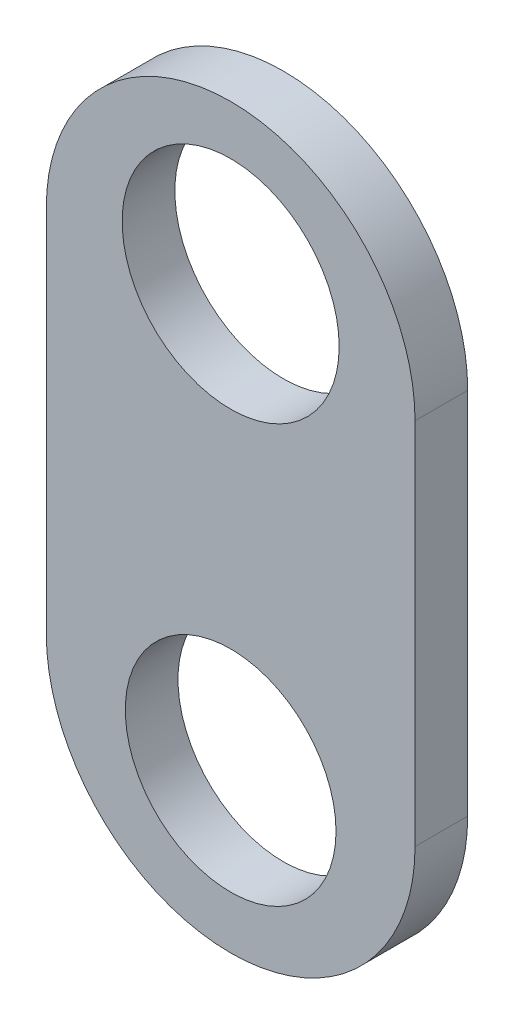
ISO-10303-21;
HEADER;
FILE_DESCRIPTION(('STEP AP214'),'2;1');
FILE_NAME('part.step','',(''),(''),'','','');
FILE_SCHEMA(('AUTOMOTIVE_DESIGN { 1 0 10303 214 1 1 1 1 }'));
ENDSEC;
DATA;
#1=APPLICATION_CONTEXT('core data for automotive mechanical design processes');
#2=APPLICATION_PROTOCOL_DEFINITION('international standard','automotive_design',2000,#1);
#3=PRODUCT_CONTEXT('',#1,'mechanical');
#4=PRODUCT('Part','Part','',(#3));
#5=PRODUCT_RELATED_PRODUCT_CATEGORY('part','',(#4));
#6=PRODUCT_DEFINITION_FORMATION('','',#4);
#7=PRODUCT_DEFINITION_CONTEXT('part definition',#1,'design');
#8=PRODUCT_DEFINITION('design','',#6,#7);
#9=PRODUCT_DEFINITION_SHAPE('','',#8);
#10=(LENGTH_UNIT() NAMED_UNIT(*) SI_UNIT(.MILLI.,.METRE.));
#11=(NAMED_UNIT(*) PLANE_ANGLE_UNIT() SI_UNIT($,.RADIAN.));
#12=(NAMED_UNIT(*) SI_UNIT($,.STERADIAN.) SOLID_ANGLE_UNIT());
#13=UNCERTAINTY_MEASURE_WITH_UNIT(LENGTH_MEASURE(1.E-05),#10,'distance_accuracy_value','');
#14=(GEOMETRIC_REPRESENTATION_CONTEXT(3) GLOBAL_UNCERTAINTY_ASSIGNED_CONTEXT((#13)) GLOBAL_UNIT_ASSIGNED_CONTEXT((#10,
#11,#12)) REPRESENTATION_CONTEXT('',''));
#15=CARTESIAN_POINT('',(0.,0.,0.));
#16=DIRECTION('',(0.,0.,1.));
#17=DIRECTION('',(1.,0.,0.));
#18=AXIS2_PLACEMENT_3D('',#15,#16,#17);
#19=CARTESIAN_POINT('',(22.225,0.,6.35));
#20=DIRECTION('',(-1.,0.,0.));
#21=DIRECTION('',(0.,-1.,0.));
#22=AXIS2_PLACEMENT_3D('',#19,#20,#21);
#23=PLANE('',#22);
#24=DIRECTION('',(0.,1.,0.));
#25=VECTOR('',#24,1.);
#26=CARTESIAN_POINT('',(22.225,0.,0.));
#27=LINE('',#26,#25);
#28=CARTESIAN_POINT('',(22.225,-22.225,0.));
#29=VERTEX_POINT('',#28);
#30=CARTESIAN_POINT('',(22.225,22.225,0.));
#31=VERTEX_POINT('',#30);
#32=EDGE_CURVE('E123',#29,#31,#27,.T.);
#33=ORIENTED_EDGE('',*,*,#32,.T.);
#34=DIRECTION('',(0.,0.,-1.));
#35=VECTOR('',#34,1.);
#36=CARTESIAN_POINT('',(22.225,22.225,6.35));
#37=LINE('',#36,#35);
#38=CARTESIAN_POINT('',(22.225,22.225,6.35));
#39=VERTEX_POINT('',#38);
#40=EDGE_CURVE('E11',#39,#31,#37,.T.);
#41=ORIENTED_EDGE('',*,*,#40,.F.);
#42=DIRECTION('',(0.,1.,0.));
#43=VECTOR('',#42,1.);
#44=CARTESIAN_POINT('',(22.225,0.,6.35));
#45=LINE('',#44,#43);
#46=CARTESIAN_POINT('',(22.225,-22.225,6.35));
#47=VERTEX_POINT('',#46);
#48=EDGE_CURVE('E92',#47,#39,#45,.T.);
#49=ORIENTED_EDGE('',*,*,#48,.F.);
#50=DIRECTION('',(0.,0.,-1.));
#51=VECTOR('',#50,1.);
#52=CARTESIAN_POINT('',(22.225,-22.225,6.35));
#53=LINE('',#52,#51);
#54=EDGE_CURVE('E108',#47,#29,#53,.T.);
#55=ORIENTED_EDGE('',*,*,#54,.T.);
#56=EDGE_LOOP('',(#33,#41,#49,#55));
#57=FACE_BOUND('',#56,.T.);
#58=ADVANCED_FACE('F44',(#57),#23,.F.);
#59=CARTESIAN_POINT('',(0.,22.225,6.35));
#60=DIRECTION('',(0.,0.,-1.));
#61=DIRECTION('',(-1.,0.,0.));
#62=AXIS2_PLACEMENT_3D('',#59,#60,#61);
#63=CYLINDRICAL_SURFACE('',#62,22.225);
#64=CARTESIAN_POINT('',(0.,22.225,0.));
#65=DIRECTION('',(0.,0.,1.));
#66=DIRECTION('',(1.,0.,0.));
#67=AXIS2_PLACEMENT_3D('',#64,#65,#66);
#68=CIRCLE('',#67,22.225);
#69=CARTESIAN_POINT('',(-22.225,22.225,0.));
#70=VERTEX_POINT('',#69);
#71=EDGE_CURVE('E99',#31,#70,#68,.T.);
#72=ORIENTED_EDGE('',*,*,#71,.T.);
#73=DIRECTION('',(0.,0.,-1.));
#74=VECTOR('',#73,1.);
#75=CARTESIAN_POINT('',(-22.225,22.225,6.35));
#76=LINE('',#75,#74);
#77=CARTESIAN_POINT('',(-22.225,22.225,6.35));
#78=VERTEX_POINT('',#77);
#79=EDGE_CURVE('E54',#78,#70,#76,.T.);
#80=ORIENTED_EDGE('',*,*,#79,.F.);
#81=CARTESIAN_POINT('',(0.,22.225,6.35));
#82=DIRECTION('',(0.,0.,1.));
#83=DIRECTION('',(1.,0.,0.));
#84=AXIS2_PLACEMENT_3D('',#81,#82,#83);
#85=CIRCLE('',#84,22.225);
#86=EDGE_CURVE('E87',#39,#78,#85,.T.);
#87=ORIENTED_EDGE('',*,*,#86,.F.);
#88=ORIENTED_EDGE('',*,*,#40,.T.);
#89=EDGE_LOOP('',(#72,#80,#87,#88));
#90=FACE_BOUND('',#89,.T.);
#91=ADVANCED_FACE('F98',(#90),#63,.T.);
#92=CARTESIAN_POINT('',(-22.225,0.,6.35));
#93=DIRECTION('',(-1.,0.,0.));
#94=DIRECTION('',(0.,-1.,0.));
#95=AXIS2_PLACEMENT_3D('',#92,#93,#94);
#96=PLANE('',#95);
#97=DIRECTION('',(0.,1.,0.));
#98=VECTOR('',#97,1.);
#99=CARTESIAN_POINT('',(-22.225,0.,0.));
#100=LINE('',#99,#98);
#101=CARTESIAN_POINT('',(-22.225,-22.225,0.));
#102=VERTEX_POINT('',#101);
#103=EDGE_CURVE('E130',#102,#70,#100,.T.);
#104=ORIENTED_EDGE('',*,*,#103,.F.);
#105=DIRECTION('',(0.,0.,-1.));
#106=VECTOR('',#105,1.);
#107=CARTESIAN_POINT('',(-22.225,-22.225,6.35));
#108=LINE('',#107,#106);
#109=CARTESIAN_POINT('',(-22.225,-22.225,6.35));
#110=VERTEX_POINT('',#109);
#111=EDGE_CURVE('E80',#110,#102,#108,.T.);
#112=ORIENTED_EDGE('',*,*,#111,.F.);
#113=DIRECTION('',(0.,1.,0.));
#114=VECTOR('',#113,1.);
#115=CARTESIAN_POINT('',(-22.225,0.,6.35));
#116=LINE('',#115,#114);
#117=EDGE_CURVE('E95',#110,#78,#116,.T.);
#118=ORIENTED_EDGE('',*,*,#117,.T.);
#119=ORIENTED_EDGE('',*,*,#79,.T.);
#120=EDGE_LOOP('',(#104,#112,#118,#119));
#121=FACE_BOUND('',#120,.T.);
#122=ADVANCED_FACE('F103',(#121),#96,.T.);
#123=CARTESIAN_POINT('',(0.,25.4,6.35));
#124=DIRECTION('',(0.,0.,-1.));
#125=DIRECTION('',(-1.,0.,0.));
#126=AXIS2_PLACEMENT_3D('',#123,#124,#125);
#127=CYLINDRICAL_SURFACE('',#126,13.081);
#128=CARTESIAN_POINT('',(0.,25.4,6.35));
#129=DIRECTION('',(0.,0.,1.));
#130=DIRECTION('',(1.,0.,0.));
#131=AXIS2_PLACEMENT_3D('',#128,#129,#130);
#132=CIRCLE('',#131,13.081);
#133=CARTESIAN_POINT('',(13.081,25.4,6.35));
#134=VERTEX_POINT('',#133);
#135=EDGE_CURVE('E170',#134,#134,#132,.T.);
#136=ORIENTED_EDGE('',*,*,#135,.T.);
#137=EDGE_LOOP('',(#136));
#138=FACE_BOUND('',#137,.T.);
#139=CARTESIAN_POINT('',(0.,25.4,0.));
#140=DIRECTION('',(0.,0.,1.));
#141=DIRECTION('',(1.,0.,0.));
#142=AXIS2_PLACEMENT_3D('',#139,#140,#141);
#143=CIRCLE('',#142,13.081);
#144=CARTESIAN_POINT('',(13.081,25.4,0.));
#145=VERTEX_POINT('',#144);
#146=EDGE_CURVE('E117',#145,#145,#143,.T.);
#147=ORIENTED_EDGE('',*,*,#146,.F.);
#148=EDGE_LOOP('',(#147));
#149=FACE_BOUND('',#148,.T.);
#150=ADVANCED_FACE('F156',(#138,#149),#127,.F.);
#151=CARTESIAN_POINT('',(0.,-25.4,6.35));
#152=DIRECTION('',(0.,0.,-1.));
#153=DIRECTION('',(-1.,0.,0.));
#154=AXIS2_PLACEMENT_3D('',#151,#152,#153);
#155=CYLINDRICAL_SURFACE('',#154,12.7);
#156=CARTESIAN_POINT('',(0.,-25.4,6.35));
#157=DIRECTION('',(0.,0.,1.));
#158=DIRECTION('',(1.,0.,0.));
#159=AXIS2_PLACEMENT_3D('',#156,#157,#158);
#160=CIRCLE('',#159,12.7);
#161=CARTESIAN_POINT('',(12.7,-25.4,6.35));
#162=VERTEX_POINT('',#161);
#163=EDGE_CURVE('E135',#162,#162,#160,.T.);
#164=ORIENTED_EDGE('',*,*,#163,.T.);
#165=EDGE_LOOP('',(#164));
#166=FACE_BOUND('',#165,.T.);
#167=CARTESIAN_POINT('',(0.,-25.4,0.));
#168=DIRECTION('',(0.,0.,1.));
#169=DIRECTION('',(1.,0.,0.));
#170=AXIS2_PLACEMENT_3D('',#167,#168,#169);
#171=CIRCLE('',#170,12.7);
#172=CARTESIAN_POINT('',(12.7,-25.4,0.));
#173=VERTEX_POINT('',#172);
#174=EDGE_CURVE('E111',#173,#173,#171,.T.);
#175=ORIENTED_EDGE('',*,*,#174,.F.);
#176=EDGE_LOOP('',(#175));
#177=FACE_BOUND('',#176,.T.);
#178=ADVANCED_FACE('F50',(#166,#177),#155,.F.);
#179=CARTESIAN_POINT('',(0.,-22.225,6.35));
#180=DIRECTION('',(0.,0.,-1.));
#181=DIRECTION('',(-1.,0.,0.));
#182=AXIS2_PLACEMENT_3D('',#179,#180,#181);
#183=CYLINDRICAL_SURFACE('',#182,22.225);
#184=CARTESIAN_POINT('',(0.,-22.225,0.));
#185=DIRECTION('',(0.,0.,1.));
#186=DIRECTION('',(1.,0.,0.));
#187=AXIS2_PLACEMENT_3D('',#184,#185,#186);
#188=CIRCLE('',#187,22.225);
#189=EDGE_CURVE('E85',#102,#29,#188,.T.);
#190=ORIENTED_EDGE('',*,*,#189,.T.);
#191=ORIENTED_EDGE('',*,*,#54,.F.);
#192=CARTESIAN_POINT('',(0.,-22.225,6.35));
#193=DIRECTION('',(0.,0.,1.));
#194=DIRECTION('',(1.,0.,0.));
#195=AXIS2_PLACEMENT_3D('',#192,#193,#194);
#196=CIRCLE('',#195,22.225);
#197=EDGE_CURVE('E64',#110,#47,#196,.T.);
#198=ORIENTED_EDGE('',*,*,#197,.F.);
#199=ORIENTED_EDGE('',*,*,#111,.T.);
#200=EDGE_LOOP('',(#190,#191,#198,#199));
#201=FACE_BOUND('',#200,.T.);
#202=ADVANCED_FACE('F147',(#201),#183,.T.);
#203=CARTESIAN_POINT('',(0.,0.,6.35));
#204=DIRECTION('',(0.,0.,1.));
#205=DIRECTION('',(1.,0.,0.));
#206=AXIS2_PLACEMENT_3D('',#203,#204,#205);
#207=PLANE('',#206);
#208=ORIENTED_EDGE('',*,*,#163,.F.);
#209=EDGE_LOOP('',(#208));
#210=FACE_BOUND('',#209,.T.);
#211=ORIENTED_EDGE('',*,*,#135,.F.);
#212=EDGE_LOOP('',(#211));
#213=FACE_BOUND('',#212,.T.);
#214=ORIENTED_EDGE('',*,*,#48,.T.);
#215=ORIENTED_EDGE('',*,*,#86,.T.);
#216=ORIENTED_EDGE('',*,*,#117,.F.);
#217=ORIENTED_EDGE('',*,*,#197,.T.);
#218=EDGE_LOOP('',(#214,#215,#216,#217));
#219=FACE_BOUND('',#218,.T.);
#220=ADVANCED_FACE('F89',(#210,#213,#219),#207,.T.);
#221=CARTESIAN_POINT('',(0.,0.,0.));
#222=DIRECTION('',(0.,0.,1.));
#223=DIRECTION('',(1.,0.,0.));
#224=AXIS2_PLACEMENT_3D('',#221,#222,#223);
#225=PLANE('',#224);
#226=ORIENTED_EDGE('',*,*,#174,.T.);
#227=EDGE_LOOP('',(#226));
#228=FACE_BOUND('',#227,.T.);
#229=ORIENTED_EDGE('',*,*,#146,.T.);
#230=EDGE_LOOP('',(#229));
#231=FACE_BOUND('',#230,.T.);
#232=ORIENTED_EDGE('',*,*,#32,.F.);
#233=ORIENTED_EDGE('',*,*,#189,.F.);
#234=ORIENTED_EDGE('',*,*,#103,.T.);
#235=ORIENTED_EDGE('',*,*,#71,.F.);
#236=EDGE_LOOP('',(#232,#233,#234,#235));
#237=FACE_BOUND('',#236,.T.);
#238=ADVANCED_FACE('F137',(#228,#231,#237),#225,.F.);
#239=CLOSED_SHELL('',(#58,#91,#122,#150,#178,#202,#220,#238));
#240=MANIFOLD_SOLID_BREP('B2',#239);
#241=ADVANCED_BREP_SHAPE_REPRESENTATION('',(#18,#240),#14);
#242=SHAPE_DEFINITION_REPRESENTATION(#9,#241);
ENDSEC;
END-ISO-10303-21;
